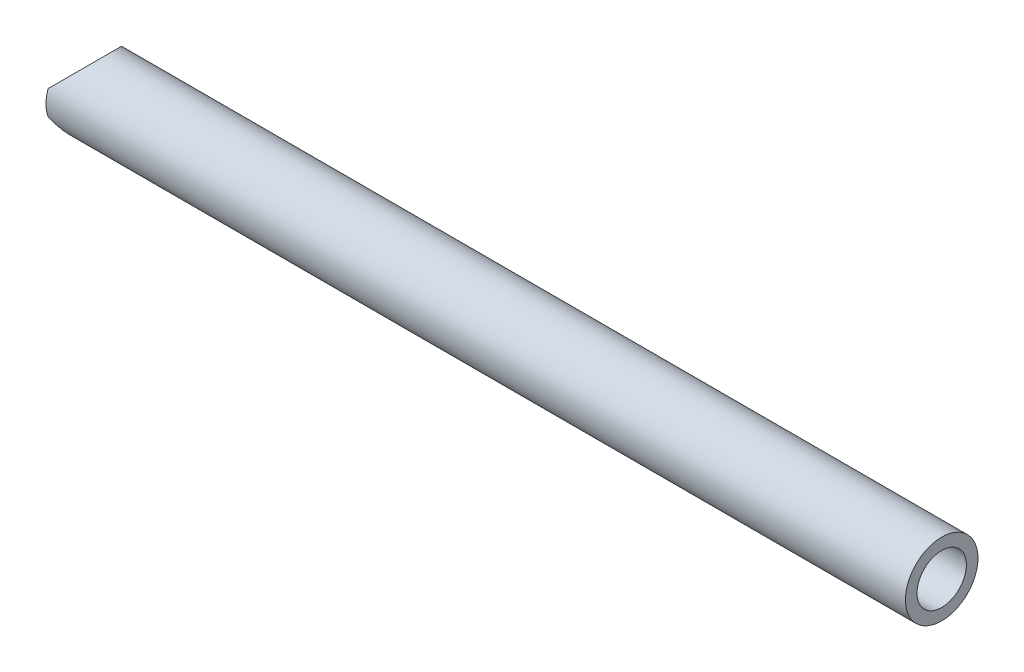
ISO-10303-21;
HEADER;
FILE_DESCRIPTION(('STEP AP214'),'2;1');
FILE_NAME('part.step','',(''),(''),'','','');
FILE_SCHEMA(('AUTOMOTIVE_DESIGN { 1 0 10303 214 1 1 1 1 }'));
ENDSEC;
DATA;
#1=APPLICATION_CONTEXT('core data for automotive mechanical design processes');
#2=APPLICATION_PROTOCOL_DEFINITION('international standard','automotive_design',2000,#1);
#3=PRODUCT_CONTEXT('',#1,'mechanical');
#4=PRODUCT('Part','Part','',(#3));
#5=PRODUCT_RELATED_PRODUCT_CATEGORY('part','',(#4));
#6=PRODUCT_DEFINITION_FORMATION('','',#4);
#7=PRODUCT_DEFINITION_CONTEXT('part definition',#1,'design');
#8=PRODUCT_DEFINITION('design','',#6,#7);
#9=PRODUCT_DEFINITION_SHAPE('','',#8);
#10=(LENGTH_UNIT() NAMED_UNIT(*) SI_UNIT(.MILLI.,.METRE.));
#11=(NAMED_UNIT(*) PLANE_ANGLE_UNIT() SI_UNIT($,.RADIAN.));
#12=(NAMED_UNIT(*) SI_UNIT($,.STERADIAN.) SOLID_ANGLE_UNIT());
#13=UNCERTAINTY_MEASURE_WITH_UNIT(LENGTH_MEASURE(1.E-05),#10,'distance_accuracy_value','');
#14=(GEOMETRIC_REPRESENTATION_CONTEXT(3) GLOBAL_UNCERTAINTY_ASSIGNED_CONTEXT((#13)) GLOBAL_UNIT_ASSIGNED_CONTEXT((#10,
#11,#12)) REPRESENTATION_CONTEXT('',''));
#15=CARTESIAN_POINT('',(0.,0.,0.));
#16=DIRECTION('',(0.,0.,1.));
#17=DIRECTION('',(1.,0.,0.));
#18=AXIS2_PLACEMENT_3D('',#15,#16,#17);
#19=CARTESIAN_POINT('',(-112.7125,0.,0.));
#20=DIRECTION('',(1.,0.,0.));
#21=DIRECTION('',(0.,0.,-1.));
#22=AXIS2_PLACEMENT_3D('',#19,#20,#21);
#23=PLANE('',#22);
#24=DIRECTION('',(0.,1.,0.));
#25=VECTOR('',#24,1.);
#26=CARTESIAN_POINT('',(-112.7125,-65.5701,-8.98025612106923));
#27=LINE('',#26,#25);
#28=CARTESIAN_POINT('',(-112.7125,-3.1749999999999,-8.98025612106919));
#29=VERTEX_POINT('',#28);
#30=CARTESIAN_POINT('',(-112.7125,3.1749999999999,-8.98025612106919));
#31=VERTEX_POINT('',#30);
#32=EDGE_CURVE('E48',#29,#31,#27,.T.);
#33=ORIENTED_EDGE('',*,*,#32,.T.);
#34=CARTESIAN_POINT('',(-112.7125,0.,0.));
#35=DIRECTION('',(1.,0.,0.));
#36=DIRECTION('',(0.,0.,-1.));
#37=AXIS2_PLACEMENT_3D('',#34,#35,#36);
#38=CIRCLE('',#37,9.525);
#39=EDGE_CURVE('E51',#29,#31,#38,.T.);
#40=ORIENTED_EDGE('',*,*,#39,.F.);
#41=EDGE_LOOP('',(#33,#40));
#42=FACE_BOUND('',#41,.T.);
#43=ADVANCED_FACE('F16',(#42),#23,.F.);
#44=CARTESIAN_POINT('',(-112.7125,0.,0.));
#45=DIRECTION('',(1.,0.,0.));
#46=DIRECTION('',(0.,0.,-1.));
#47=AXIS2_PLACEMENT_3D('',#44,#45,#46);
#48=CYLINDRICAL_SURFACE('',#47,6.477);
#49=CARTESIAN_POINT('',(112.7125,0.,0.));
#50=DIRECTION('',(1.,0.,0.));
#51=DIRECTION('',(0.,0.,-1.));
#52=AXIS2_PLACEMENT_3D('',#49,#50,#51);
#53=CIRCLE('',#52,6.477);
#54=CARTESIAN_POINT('',(112.7125,0.,-6.477));
#55=VERTEX_POINT('',#54);
#56=EDGE_CURVE('E19',#55,#55,#53,.F.);
#57=ORIENTED_EDGE('',*,*,#56,.F.);
#58=EDGE_LOOP('',(#57));
#59=FACE_BOUND('',#58,.T.);
#60=CARTESIAN_POINT('',(-106.3625,-6.477,0.));
#61=CARTESIAN_POINT('',(-106.362500930984,-6.47699902063564,0.161859991408697));
#62=CARTESIAN_POINT('',(-106.366635231302,-6.47092347500914,0.323737483139683));
#63=CARTESIAN_POINT('',(-106.383074916608,-6.44671059452453,0.646234711803034));
#64=CARTESIAN_POINT('',(-106.395384245568,-6.42856743774703,0.806853803769706));
#65=CARTESIAN_POINT('',(-106.427899759226,-6.38045887651486,1.12575090691301));
#66=CARTESIAN_POINT('',(-106.448118070929,-6.35047531625192,1.28402493369037));
#67=CARTESIAN_POINT('',(-106.495981746217,-6.2791097005026,1.59689476580041));
#68=CARTESIAN_POINT('',(-106.523630319914,-6.23772271817282,1.751488949823));
#69=CARTESIAN_POINT('',(-106.58555061213,-6.14437797195406,2.05504483319672));
#70=CARTESIAN_POINT('',(-106.619782172855,-6.09248420539763,2.20403444783158));
#71=CARTESIAN_POINT('',(-106.694262405167,-5.97857585926296,2.49656391181815));
#72=CARTESIAN_POINT('',(-106.734513427471,-5.91655732489571,2.64010160450528));
#73=CARTESIAN_POINT('',(-106.863091205838,-5.71632729768525,3.06131037303474));
#74=CARTESIAN_POINT('',(-106.959319310904,-5.56382831896324,3.3299388683533));
#75=CARTESIAN_POINT('',(-107.17499853693,-5.21102308701011,3.8609880499028));
#76=CARTESIAN_POINT('',(-107.295738193239,-5.00772336343045,4.12086383877963));
#77=CARTESIAN_POINT('',(-107.54539428714,-4.56617268089548,4.60533984344896));
#78=CARTESIAN_POINT('',(-107.67432295096,-4.3278687295286,4.82988548670452));
#79=CARTESIAN_POINT('',(-107.876859640412,-3.92587947637852,5.15511939740143));
#80=CARTESIAN_POINT('',(-107.951114917699,-3.77252181201225,5.26840752743897));
#81=CARTESIAN_POINT('',(-108.096857583297,-3.45541080784627,5.48162066039673));
#82=CARTESIAN_POINT('',(-108.168344303871,-3.29165498498652,5.58154245362993));
#83=CARTESIAN_POINT('',(-108.30597969795,-2.9544879902085,5.7671056597381));
#84=CARTESIAN_POINT('',(-108.372136821888,-2.78109287058016,5.85276991837299));
#85=CARTESIAN_POINT('',(-108.496544325292,-2.42486119568456,6.00910844296647));
#86=CARTESIAN_POINT('',(-108.554794566262,-2.24202447511739,6.07978244637075));
#87=CARTESIAN_POINT('',(-108.644657002277,-1.92367949535163,6.18628784096023));
#88=CARTESIAN_POINT('',(-108.679033221787,-1.79031358505836,6.22622506177775));
#89=CARTESIAN_POINT('',(-108.741389490245,-1.51989866178684,6.29769648410807));
#90=CARTESIAN_POINT('',(-108.769371359268,-1.38285070930109,6.32923307718305));
#91=CARTESIAN_POINT('',(-108.817943769552,-1.10592771933484,6.38344162112075));
#92=CARTESIAN_POINT('',(-108.838545263158,-0.966057199085886,6.40612671195239));
#93=CARTESIAN_POINT('',(-108.871618039644,-0.684169243413154,6.44233112113181));
#94=CARTESIAN_POINT('',(-108.884089300497,-0.542151802173893,6.45585041464713));
#95=CARTESIAN_POINT('',(-108.900414386746,-0.256348970234704,6.47351588669589));
#96=CARTESIAN_POINT('',(-108.90422667664,-0.112558370833677,6.47761688844381));
#97=CARTESIAN_POINT('',(-108.902943326849,0.174934617387535,6.47623293328364));
#98=CARTESIAN_POINT('',(-108.89784768356,0.318637006172018,6.4707479724982));
#99=CARTESIAN_POINT('',(-108.878964476622,0.604877368980781,6.45029057713175));
#100=CARTESIAN_POINT('',(-108.865171475677,0.747414558054187,6.43531220756058));
#101=CARTESIAN_POINT('',(-108.829482809079,1.03015441555673,6.39614774621474));
#102=CARTESIAN_POINT('',(-108.807586958341,1.17035703058341,6.37196144411342));
#103=CARTESIAN_POINT('',(-108.733664311498,1.57151737734538,6.28916546635215));
#104=CARTESIAN_POINT('',(-108.672194156112,1.82846527571214,6.21910574963729));
#105=CARTESIAN_POINT('',(-108.530068010104,2.32704967278988,6.05027939563834));
#106=CARTESIAN_POINT('',(-108.449397159026,2.56867412750302,5.95149051009416));
#107=CARTESIAN_POINT('',(-108.298015243724,2.9752478103939,5.75642971591142));
#108=CARTESIAN_POINT('',(-108.230009123286,3.14403898346144,5.66593829377763));
#109=CARTESIAN_POINT('',(-108.089729382188,3.47175453459501,5.47126926165319));
#110=CARTESIAN_POINT('',(-108.017454186027,3.6306752250095,5.36708658131105));
#111=CARTESIAN_POINT('',(-107.87083002243,3.9384300509092,5.14551354529919));
#112=CARTESIAN_POINT('',(-107.796477893223,4.08724747553892,5.02810212298997));
#113=CARTESIAN_POINT('',(-107.647877528438,4.37405079028782,4.78069737839076));
#114=CARTESIAN_POINT('',(-107.573629281547,4.51203796771268,4.65070555554734));
#115=CARTESIAN_POINT('',(-107.426496934869,4.7777417550274,4.37736795593036));
#116=CARTESIAN_POINT('',(-107.353630084736,4.9053597052468,4.23391683747296));
#117=CARTESIAN_POINT('',(-107.211766004001,5.14820099638157,3.93505085849177));
#118=CARTESIAN_POINT('',(-107.142769142432,5.26342315621799,3.77963486036258));
#119=CARTESIAN_POINT('',(-107.010533224316,5.48031192519518,3.45764864801703));
#120=CARTESIAN_POINT('',(-106.947286159453,5.58199748275943,3.29109452645894));
#121=CARTESIAN_POINT('',(-106.828185309582,5.77082786323259,2.94745279497759));
#122=CARTESIAN_POINT('',(-106.772329072914,5.85797751045144,2.77036870641003));
#123=CARTESIAN_POINT('',(-106.681005682014,5.99897047854087,2.44698855291378));
#124=CARTESIAN_POINT('',(-106.643760855192,6.05591773029685,2.30253994989053));
#125=CARTESIAN_POINT('',(-106.575475232972,6.1596457176452,2.00862296214986));
#126=CARTESIAN_POINT('',(-106.544433197538,6.2064284854405,1.85915558775618));
#127=CARTESIAN_POINT('',(-106.489253495121,6.28918836563251,1.55634958893365));
#128=CARTESIAN_POINT('',(-106.465101652386,6.32518767146095,1.40301962952513));
#129=CARTESIAN_POINT('',(-106.424158893947,6.3860188295028,1.09324664274337));
#130=CARTESIAN_POINT('',(-106.407364737208,6.41085559889845,0.936805017859289));
#131=CARTESIAN_POINT('',(-106.383849337593,6.44557282711493,0.650388584800365));
#132=CARTESIAN_POINT('',(-106.375855732223,6.45734574240924,0.520743628143343));
#133=CARTESIAN_POINT('',(-106.365180174885,6.47306048049024,0.260736321547763));
#134=CARTESIAN_POINT('',(-106.362499250117,6.47700078885146,0.13037383776121));
#135=CARTESIAN_POINT('',(-106.362500930984,6.47699902063564,-0.161859991408697));
#136=CARTESIAN_POINT('',(-106.366635231302,6.47092347500914,-0.323737483139682));
#137=CARTESIAN_POINT('',(-106.383074916608,6.44671059452453,-0.646234711803034));
#138=CARTESIAN_POINT('',(-106.395384245568,6.42856743774703,-0.806853803769706));
#139=CARTESIAN_POINT('',(-106.427899759226,6.38045887651486,-1.12575090691301));
#140=CARTESIAN_POINT('',(-106.448118070929,6.35047531625192,-1.28402493369037));
#141=CARTESIAN_POINT('',(-106.495981746217,6.2791097005026,-1.59689476580041));
#142=CARTESIAN_POINT('',(-106.523630319914,6.23772271817283,-1.751488949823));
#143=CARTESIAN_POINT('',(-106.58555061213,6.14437797195406,-2.05504483319672));
#144=CARTESIAN_POINT('',(-106.619782172855,6.09248420539763,-2.20403444783158));
#145=CARTESIAN_POINT('',(-106.694262405167,5.97857585926296,-2.49656391181815));
#146=CARTESIAN_POINT('',(-106.734513427471,5.91655732489571,-2.64010160450528));
#147=CARTESIAN_POINT('',(-106.863091205838,5.71632729768525,-3.06131037303474));
#148=CARTESIAN_POINT('',(-106.959319310904,5.56382831896325,-3.3299388683533));
#149=CARTESIAN_POINT('',(-107.17499853693,5.21102308701012,-3.8609880499028));
#150=CARTESIAN_POINT('',(-107.295738193239,5.00772336343045,-4.12086383877963));
#151=CARTESIAN_POINT('',(-107.54539428714,4.56617268089548,-4.60533984344896));
#152=CARTESIAN_POINT('',(-107.67432295096,4.3278687295286,-4.82988548670452));
#153=CARTESIAN_POINT('',(-107.876859640412,3.92587947637852,-5.15511939740143));
#154=CARTESIAN_POINT('',(-107.951114917699,3.77252181201225,-5.26840752743897));
#155=CARTESIAN_POINT('',(-108.096857583297,3.45541080784627,-5.48162066039673));
#156=CARTESIAN_POINT('',(-108.168344303871,3.29165498498653,-5.58154245362993));
#157=CARTESIAN_POINT('',(-108.30597969795,2.9544879902085,-5.76710565973809));
#158=CARTESIAN_POINT('',(-108.372136821888,2.78109287058017,-5.85276991837298));
#159=CARTESIAN_POINT('',(-108.496544325292,2.42486119568457,-6.00910844296647));
#160=CARTESIAN_POINT('',(-108.554794566262,2.2420244751174,-6.07978244637075));
#161=CARTESIAN_POINT('',(-108.644657002277,1.92367949535163,-6.18628784096023));
#162=CARTESIAN_POINT('',(-108.679033221787,1.79031358505836,-6.22622506177775));
#163=CARTESIAN_POINT('',(-108.741389490245,1.51989866178684,-6.29769648410807));
#164=CARTESIAN_POINT('',(-108.769371359268,1.38285070930109,-6.32923307718305));
#165=CARTESIAN_POINT('',(-108.817943769552,1.10592771933484,-6.38344162112075));
#166=CARTESIAN_POINT('',(-108.838545263158,0.966057199085883,-6.40612671195239));
#167=CARTESIAN_POINT('',(-108.871618039644,0.684169243413151,-6.44233112113181));
#168=CARTESIAN_POINT('',(-108.884089300497,0.542151802173889,-6.45585041464713));
#169=CARTESIAN_POINT('',(-108.900414386746,0.256348970234699,-6.47351588669589));
#170=CARTESIAN_POINT('',(-108.90422667664,0.112558370833673,-6.47761688844381));
#171=CARTESIAN_POINT('',(-108.902943326849,-0.174934617387539,-6.47623293328364));
#172=CARTESIAN_POINT('',(-108.89784768356,-0.318637006172022,-6.4707479724982));
#173=CARTESIAN_POINT('',(-108.878964476622,-0.604877368980785,-6.45029057713175));
#174=CARTESIAN_POINT('',(-108.865171475677,-0.747414558054192,-6.43531220756058));
#175=CARTESIAN_POINT('',(-108.829482809079,-1.03015441555673,-6.39614774621474));
#176=CARTESIAN_POINT('',(-108.807586958341,-1.17035703058341,-6.37196144411342));
#177=CARTESIAN_POINT('',(-108.733664311498,-1.57151737734538,-6.28916546635215));
#178=CARTESIAN_POINT('',(-108.672194156112,-1.82846527571215,-6.21910574963729));
#179=CARTESIAN_POINT('',(-108.530068010104,-2.32704967278988,-6.05027939563834));
#180=CARTESIAN_POINT('',(-108.449397159026,-2.56867412750303,-5.95149051009416));
#181=CARTESIAN_POINT('',(-108.298015243724,-2.9752478103939,-5.75642971591141));
#182=CARTESIAN_POINT('',(-108.230009123286,-3.14403898346144,-5.66593829377763));
#183=CARTESIAN_POINT('',(-108.089729382188,-3.47175453459501,-5.47126926165318));
#184=CARTESIAN_POINT('',(-108.017454186027,-3.6306752250095,-5.36708658131105));
#185=CARTESIAN_POINT('',(-107.87083002243,-3.93843005090921,-5.14551354529919));
#186=CARTESIAN_POINT('',(-107.796477893223,-4.08724747553892,-5.02810212298997));
#187=CARTESIAN_POINT('',(-107.647877528438,-4.37405079028783,-4.78069737839076));
#188=CARTESIAN_POINT('',(-107.573629281547,-4.51203796771268,-4.65070555554734));
#189=CARTESIAN_POINT('',(-107.426496934869,-4.7777417550274,-4.37736795593036));
#190=CARTESIAN_POINT('',(-107.353630084736,-4.9053597052468,-4.23391683747296));
#191=CARTESIAN_POINT('',(-107.211766004001,-5.14820099638157,-3.93505085849178));
#192=CARTESIAN_POINT('',(-107.142769142432,-5.26342315621798,-3.77963486036259));
#193=CARTESIAN_POINT('',(-107.010533224316,-5.48031192519517,-3.45764864801704));
#194=CARTESIAN_POINT('',(-106.947286159453,-5.58199748275943,-3.29109452645894));
#195=CARTESIAN_POINT('',(-106.828185309582,-5.77082786323259,-2.9474527949776));
#196=CARTESIAN_POINT('',(-106.772329072914,-5.85797751045144,-2.77036870641003));
#197=CARTESIAN_POINT('',(-106.681005682014,-5.99897047854087,-2.44698855291378));
#198=CARTESIAN_POINT('',(-106.643760855192,-6.05591773029685,-2.30253994989053));
#199=CARTESIAN_POINT('',(-106.575475232972,-6.1596457176452,-2.00862296214986));
#200=CARTESIAN_POINT('',(-106.544433197538,-6.2064284854405,-1.85915558775618));
#201=CARTESIAN_POINT('',(-106.489253495121,-6.28918836563251,-1.55634958893366));
#202=CARTESIAN_POINT('',(-106.465101652386,-6.32518767146095,-1.40301962952514));
#203=CARTESIAN_POINT('',(-106.424158893947,-6.3860188295028,-1.09324664274338));
#204=CARTESIAN_POINT('',(-106.407364737208,-6.41085559889845,-0.93680501785929));
#205=CARTESIAN_POINT('',(-106.383849337593,-6.44557282711493,-0.650388584800365));
#206=CARTESIAN_POINT('',(-106.375855732223,-6.45734574240924,-0.520743628143343));
#207=CARTESIAN_POINT('',(-106.365180174885,-6.47306048049024,-0.260736321547764));
#208=CARTESIAN_POINT('',(-106.362499250117,-6.47700078885146,-0.130373837761211));
#209=CARTESIAN_POINT('',(-106.3625,-6.477,0.));
#210=B_SPLINE_CURVE_WITH_KNOTS('',3,(#60,#61,#62,#63,#64,#65,#66,#67,#68,#69,#70,#71,#72,#73,
#74,#75,#76,#77,#78,#79,#80,#81,#82,#83,#84,#85,#86,#87,#88,#89,#90,#91,#92,#93,#94,#95,#96,#97,
#98,#99,#100,#101,#102,#103,#104,#105,#106,#107,#108,#109,#110,#111,#112,#113,#114,#115,#116,
#117,#118,#119,#120,#121,#122,#123,#124,#125,#126,#127,#128,#129,#130,#131,#132,#133,#134,#135,
#136,#137,#138,#139,#140,#141,#142,#143,#144,#145,#146,#147,#148,#149,#150,#151,#152,#153,#154,
#155,#156,#157,#158,#159,#160,#161,#162,#163,#164,#165,#166,#167,#168,#169,#170,#171,#172,#173,
#174,#175,#176,#177,#178,#179,#180,#181,#182,#183,#184,#185,#186,#187,#188,#189,#190,#191,#192,
#193,#194,#195,#196,#197,#198,#199,#200,#201,#202,#203,#204,#205,#206,#207,#208,#209),
.UNSPECIFIED.,.T.,.F.,(4,2,2,2,2,2,2,2,2,2,2,2,2,2,2,2,2,2,2,2,2,2,2,2,2,2,2,2,2,2,2,2,2,2,2,2,
2,2,2,2,2,2,2,2,2,2,2,2,2,2,2,2,2,2,2,2,2,2,2,2,2,2,2,2,2,2,2,2,2,2,2,2,2,2,4),(0.,
0.485445035240253,0.971124439466947,1.45755148350196,1.94418901856093,2.42794707431411,
2.9118945426819,3.87864232463296,4.92897664541365,5.98091776126258,6.59415554899405,
7.20754033148497,7.81993258303058,8.4323355597404,8.86214713662766,9.29183622000594,
9.72088498500895,10.1499349124087,10.5810386062942,11.0121424745532,11.4435161220252,
11.8748996234808,12.6916407028376,13.509015969617,14.1179849928111,14.7271801774201,
15.3373595897461,15.9474663646979,16.5628261978056,17.1782446109664,17.7927922991829,
18.4071356181225,18.8856747696513,19.3641181577961,19.8415699875788,20.3188112895577,
20.7097485332311,21.1007613568175,21.5862063920578,22.0718857962845,22.5583128403195,
23.0449503753785,23.5287084311317,24.0126558994994,24.9794036814505,26.0297380022312,
27.0816791180801,27.6949169058116,28.3083016883025,28.9206939398481,29.533096916558,
29.9629084934452,30.3925975768235,30.8216463418265,31.2506962692262,31.6817999631117,
32.1129038313707,32.5442774788427,32.9756609802984,33.7924020596551,34.6097773264346,
35.2187463496287,35.8279415342376,36.4381209465637,37.0482277215154,37.6635875546231,
38.279005967784,38.8935536560004,39.50789697494,39.9864361264688,40.4648795146136,
40.9423313443963,41.4195726463752,41.8105098900486,42.2015227136351),.UNSPECIFIED.);
#211=CARTESIAN_POINT('',(-106.3625,-6.477,0.));
#212=VERTEX_POINT('',#211);
#213=EDGE_CURVE('E54',#212,#212,#210,.T.);
#214=ORIENTED_EDGE('',*,*,#213,.T.);
#215=EDGE_LOOP('',(#214));
#216=FACE_BOUND('',#215,.T.);
#217=ADVANCED_FACE('F65',(#59,#216),#48,.F.);
#218=CARTESIAN_POINT('',(112.7125,0.,0.));
#219=DIRECTION('',(1.,0.,0.));
#220=DIRECTION('',(0.,0.,-1.));
#221=AXIS2_PLACEMENT_3D('',#218,#219,#220);
#222=PLANE('',#221);
#223=ORIENTED_EDGE('',*,*,#56,.T.);
#224=EDGE_LOOP('',(#223));
#225=FACE_BOUND('',#224,.T.);
#226=CARTESIAN_POINT('',(112.7125,0.,0.));
#227=DIRECTION('',(1.,0.,0.));
#228=DIRECTION('',(0.,0.,-1.));
#229=AXIS2_PLACEMENT_3D('',#226,#227,#228);
#230=CIRCLE('',#229,9.525);
#231=CARTESIAN_POINT('',(112.7125,0.,-9.525));
#232=VERTEX_POINT('',#231);
#233=EDGE_CURVE('E49',#232,#232,#230,.F.);
#234=ORIENTED_EDGE('',*,*,#233,.F.);
#235=EDGE_LOOP('',(#234));
#236=FACE_BOUND('',#235,.T.);
#237=ADVANCED_FACE('F75',(#225,#236),#222,.T.);
#238=CARTESIAN_POINT('',(-112.7125,0.,0.));
#239=DIRECTION('',(1.,0.,0.));
#240=DIRECTION('',(0.,0.,-1.));
#241=AXIS2_PLACEMENT_3D('',#238,#239,#240);
#242=PLANE('',#241);
#243=DIRECTION('',(0.,1.,0.));
#244=VECTOR('',#243,1.);
#245=CARTESIAN_POINT('',(-112.7125,-65.5701,8.98025612106923));
#246=LINE('',#245,#244);
#247=CARTESIAN_POINT('',(-112.7125,3.1749999999999,8.98025612106919));
#248=VERTEX_POINT('',#247);
#249=CARTESIAN_POINT('',(-112.7125,-3.1749999999999,8.98025612106919));
#250=VERTEX_POINT('',#249);
#251=EDGE_CURVE('E33',#248,#250,#246,.F.);
#252=ORIENTED_EDGE('',*,*,#251,.T.);
#253=CARTESIAN_POINT('',(-112.7125,0.,0.));
#254=DIRECTION('',(1.,0.,0.));
#255=DIRECTION('',(0.,0.,-1.));
#256=AXIS2_PLACEMENT_3D('',#253,#254,#255);
#257=CIRCLE('',#256,9.525);
#258=EDGE_CURVE('E25',#248,#250,#257,.T.);
#259=ORIENTED_EDGE('',*,*,#258,.F.);
#260=EDGE_LOOP('',(#252,#259));
#261=FACE_BOUND('',#260,.T.);
#262=ADVANCED_FACE('F72',(#261),#242,.F.);
#263=CARTESIAN_POINT('',(-115.8875,-65.5701,0.));
#264=DIRECTION('',(0.,1.,0.));
#265=DIRECTION('',(0.,0.,1.));
#266=AXIS2_PLACEMENT_3D('',#263,#264,#265);
#267=CYLINDRICAL_SURFACE('',#266,9.525);
#268=ORIENTED_EDGE('',*,*,#213,.F.);
#269=EDGE_LOOP('',(#268));
#270=FACE_BOUND('',#269,.T.);
#271=ORIENTED_EDGE('',*,*,#32,.F.);
#272=CARTESIAN_POINT('',(-115.8875,0.,0.));
#273=DIRECTION('',(0.707106781186547,0.707106781186547,0.));
#274=DIRECTION('',(-0.707106781186547,0.707106781186547,0.));
#275=AXIS2_PLACEMENT_3D('',#272,#273,#274);
#276=ELLIPSE('',#275,13.4703841816037,9.525);
#277=EDGE_CURVE('E11',#250,#29,#276,.T.);
#278=ORIENTED_EDGE('',*,*,#277,.F.);
#279=ORIENTED_EDGE('',*,*,#251,.F.);
#280=CARTESIAN_POINT('',(-115.8875,0.,0.));
#281=DIRECTION('',(-0.707106781186547,0.707106781186547,0.));
#282=DIRECTION('',(0.707106781186547,0.707106781186547,0.));
#283=AXIS2_PLACEMENT_3D('',#280,#281,#282);
#284=ELLIPSE('',#283,13.4703841816037,9.525);
#285=EDGE_CURVE('E45',#31,#248,#284,.F.);
#286=ORIENTED_EDGE('',*,*,#285,.F.);
#287=EDGE_LOOP('',(#271,#278,#279,#286));
#288=FACE_BOUND('',#287,.T.);
#289=ADVANCED_FACE('F46',(#270,#288),#267,.F.);
#290=CARTESIAN_POINT('',(-112.7125,0.,0.));
#291=DIRECTION('',(1.,0.,0.));
#292=DIRECTION('',(0.,0.,-1.));
#293=AXIS2_PLACEMENT_3D('',#290,#291,#292);
#294=CYLINDRICAL_SURFACE('',#293,9.525);
#295=ORIENTED_EDGE('',*,*,#233,.T.);
#296=EDGE_LOOP('',(#295));
#297=FACE_BOUND('',#296,.T.);
#298=ORIENTED_EDGE('',*,*,#258,.T.);
#299=ORIENTED_EDGE('',*,*,#277,.T.);
#300=ORIENTED_EDGE('',*,*,#39,.T.);
#301=ORIENTED_EDGE('',*,*,#285,.T.);
#302=EDGE_LOOP('',(#298,#299,#300,#301));
#303=FACE_BOUND('',#302,.T.);
#304=ADVANCED_FACE('F52',(#297,#303),#294,.T.);
#305=CLOSED_SHELL('',(#43,#217,#237,#262,#289,#304));
#306=MANIFOLD_SOLID_BREP('B1',#305);
#307=ADVANCED_BREP_SHAPE_REPRESENTATION('',(#18,#306),#14);
#308=SHAPE_DEFINITION_REPRESENTATION(#9,#307);
ENDSEC;
END-ISO-10303-21;
